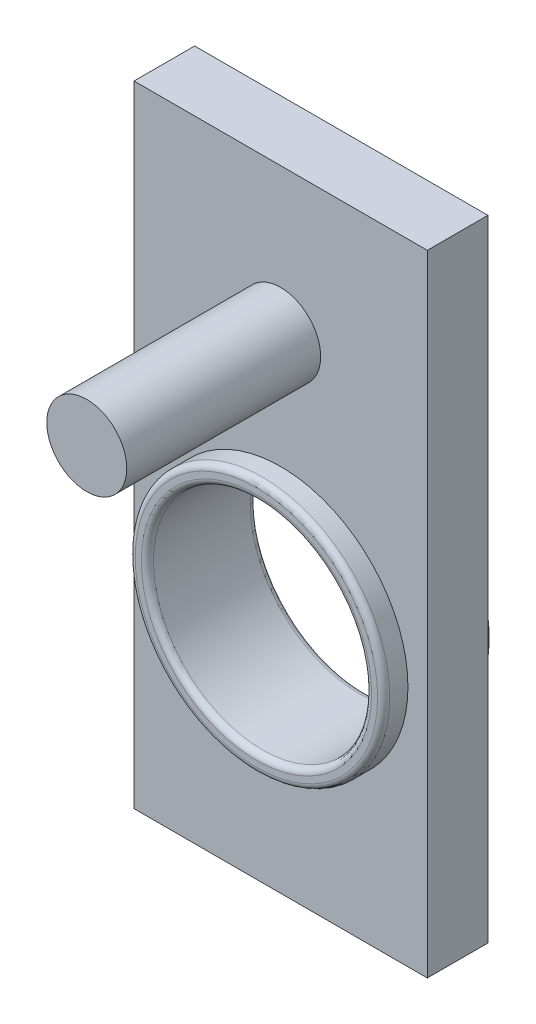
ISO-10303-21;
HEADER;
FILE_DESCRIPTION(('STEP AP214'),'2;1');
FILE_NAME('part.step','',(''),(''),'','','');
FILE_SCHEMA(('AUTOMOTIVE_DESIGN { 1 0 10303 214 1 1 1 1 }'));
ENDSEC;
DATA;
#1=APPLICATION_CONTEXT('core data for automotive mechanical design processes');
#2=APPLICATION_PROTOCOL_DEFINITION('international standard','automotive_design',2000,#1);
#3=PRODUCT_CONTEXT('',#1,'mechanical');
#4=PRODUCT('Part','Part','',(#3));
#5=PRODUCT_RELATED_PRODUCT_CATEGORY('part','',(#4));
#6=PRODUCT_DEFINITION_FORMATION('','',#4);
#7=PRODUCT_DEFINITION_CONTEXT('part definition',#1,'design');
#8=PRODUCT_DEFINITION('design','',#6,#7);
#9=PRODUCT_DEFINITION_SHAPE('','',#8);
#10=(LENGTH_UNIT() NAMED_UNIT(*) SI_UNIT(.MILLI.,.METRE.));
#11=(NAMED_UNIT(*) PLANE_ANGLE_UNIT() SI_UNIT($,.RADIAN.));
#12=(NAMED_UNIT(*) SI_UNIT($,.STERADIAN.) SOLID_ANGLE_UNIT());
#13=UNCERTAINTY_MEASURE_WITH_UNIT(LENGTH_MEASURE(1.E-05),#10,'distance_accuracy_value','');
#14=(GEOMETRIC_REPRESENTATION_CONTEXT(3) GLOBAL_UNCERTAINTY_ASSIGNED_CONTEXT((#13)) GLOBAL_UNIT_ASSIGNED_CONTEXT((#10,
#11,#12)) REPRESENTATION_CONTEXT('',''));
#15=CARTESIAN_POINT('',(0.,0.,0.));
#16=DIRECTION('',(0.,0.,1.));
#17=DIRECTION('',(1.,0.,0.));
#18=AXIS2_PLACEMENT_3D('',#15,#16,#17);
#19=CARTESIAN_POINT('',(-6.05,16.,2.5));
#20=DIRECTION('',(0.,0.,-1.));
#21=DIRECTION('',(-1.,0.,0.));
#22=AXIS2_PLACEMENT_3D('',#19,#20,#21);
#23=PLANE('',#22);
#24=CARTESIAN_POINT('',(0.,0.,2.5));
#25=DIRECTION('',(0.,0.,-1.));
#26=DIRECTION('',(-1.,0.,0.));
#27=AXIS2_PLACEMENT_3D('',#24,#25,#26);
#28=CIRCLE('',#27,5.25);
#29=CARTESIAN_POINT('',(-5.25,0.,2.5));
#30=VERTEX_POINT('',#29);
#31=EDGE_CURVE('E197',#30,#30,#28,.T.);
#32=ORIENTED_EDGE('',*,*,#31,.T.);
#33=EDGE_LOOP('',(#32));
#34=FACE_BOUND('',#33,.T.);
#35=DIRECTION('',(0.,-1.,0.));
#36=VECTOR('',#35,1.);
#37=CARTESIAN_POINT('',(-6.05,-10.,2.5));
#38=LINE('',#37,#36);
#39=CARTESIAN_POINT('',(-6.05,16.,2.5));
#40=VERTEX_POINT('',#39);
#41=CARTESIAN_POINT('',(-6.05,-10.,2.5));
#42=VERTEX_POINT('',#41);
#43=EDGE_CURVE('E84',#40,#42,#38,.T.);
#44=ORIENTED_EDGE('',*,*,#43,.T.);
#45=DIRECTION('',(1.,0.,0.));
#46=VECTOR('',#45,1.);
#47=CARTESIAN_POINT('',(-6.05,-10.,2.5));
#48=LINE('',#47,#46);
#49=CARTESIAN_POINT('',(6.05000000000001,-10.,2.5));
#50=VERTEX_POINT('',#49);
#51=EDGE_CURVE('E79',#42,#50,#48,.T.);
#52=ORIENTED_EDGE('',*,*,#51,.T.);
#53=DIRECTION('',(0.,1.,0.));
#54=VECTOR('',#53,1.);
#55=CARTESIAN_POINT('',(6.05000000000001,-10.,2.5));
#56=LINE('',#55,#54);
#57=CARTESIAN_POINT('',(6.05,16.,2.5));
#58=VERTEX_POINT('',#57);
#59=EDGE_CURVE('E82',#50,#58,#56,.T.);
#60=ORIENTED_EDGE('',*,*,#59,.T.);
#61=DIRECTION('',(-1.,0.,0.));
#62=VECTOR('',#61,1.);
#63=CARTESIAN_POINT('',(-6.05,16.,2.5));
#64=LINE('',#63,#62);
#65=EDGE_CURVE('E48',#58,#40,#64,.T.);
#66=ORIENTED_EDGE('',*,*,#65,.T.);
#67=EDGE_LOOP('',(#44,#52,#60,#66));
#68=FACE_BOUND('',#67,.T.);
#69=CARTESIAN_POINT('',(0.,10.,2.5));
#70=DIRECTION('',(0.,0.,-1.));
#71=DIRECTION('',(-1.,0.,0.));
#72=AXIS2_PLACEMENT_3D('',#69,#70,#71);
#73=CIRCLE('',#72,1.65);
#74=CARTESIAN_POINT('',(-1.65,10.,2.5));
#75=VERTEX_POINT('',#74);
#76=EDGE_CURVE('E109',#75,#75,#73,.F.);
#77=ORIENTED_EDGE('',*,*,#76,.F.);
#78=EDGE_LOOP('',(#77));
#79=FACE_BOUND('',#78,.T.);
#80=ADVANCED_FACE('F31',(#34,#68,#79),#23,.F.);
#81=CARTESIAN_POINT('',(-6.05,16.,0.));
#82=DIRECTION('',(0.,0.,-1.));
#83=DIRECTION('',(-1.,0.,0.));
#84=AXIS2_PLACEMENT_3D('',#81,#82,#83);
#85=PLANE('',#84);
#86=CARTESIAN_POINT('',(0.,0.,0.));
#87=DIRECTION('',(0.,0.,-1.));
#88=DIRECTION('',(-1.,0.,0.));
#89=AXIS2_PLACEMENT_3D('',#86,#87,#88);
#90=CIRCLE('',#89,5.25);
#91=CARTESIAN_POINT('',(-5.25,0.,0.));
#92=VERTEX_POINT('',#91);
#93=EDGE_CURVE('E112',#92,#92,#90,.T.);
#94=ORIENTED_EDGE('',*,*,#93,.F.);
#95=EDGE_LOOP('',(#94));
#96=FACE_BOUND('',#95,.T.);
#97=DIRECTION('',(0.,-1.,0.));
#98=VECTOR('',#97,1.);
#99=CARTESIAN_POINT('',(-6.05,-10.,0.));
#100=LINE('',#99,#98);
#101=CARTESIAN_POINT('',(-6.05,16.,0.));
#102=VERTEX_POINT('',#101);
#103=CARTESIAN_POINT('',(-6.05,-10.,0.));
#104=VERTEX_POINT('',#103);
#105=EDGE_CURVE('E99',#102,#104,#100,.T.);
#106=ORIENTED_EDGE('',*,*,#105,.F.);
#107=DIRECTION('',(-1.,0.,0.));
#108=VECTOR('',#107,1.);
#109=CARTESIAN_POINT('',(-6.05,16.,0.));
#110=LINE('',#109,#108);
#111=CARTESIAN_POINT('',(6.05,16.,0.));
#112=VERTEX_POINT('',#111);
#113=EDGE_CURVE('E71',#112,#102,#110,.T.);
#114=ORIENTED_EDGE('',*,*,#113,.F.);
#115=DIRECTION('',(0.,1.,0.));
#116=VECTOR('',#115,1.);
#117=CARTESIAN_POINT('',(6.05000000000001,-10.,0.));
#118=LINE('',#117,#116);
#119=CARTESIAN_POINT('',(6.05000000000001,-10.,0.));
#120=VERTEX_POINT('',#119);
#121=EDGE_CURVE('E65',#120,#112,#118,.T.);
#122=ORIENTED_EDGE('',*,*,#121,.F.);
#123=DIRECTION('',(1.,0.,0.));
#124=VECTOR('',#123,1.);
#125=CARTESIAN_POINT('',(-6.05,-10.,0.));
#126=LINE('',#125,#124);
#127=EDGE_CURVE('E89',#104,#120,#126,.T.);
#128=ORIENTED_EDGE('',*,*,#127,.F.);
#129=EDGE_LOOP('',(#106,#114,#122,#128));
#130=FACE_BOUND('',#129,.T.);
#131=ADVANCED_FACE('F147',(#96,#130),#85,.T.);
#132=CARTESIAN_POINT('',(-6.05,-10.,2.5));
#133=DIRECTION('',(1.,0.,0.));
#134=DIRECTION('',(0.,0.,-1.));
#135=AXIS2_PLACEMENT_3D('',#132,#133,#134);
#136=PLANE('',#135);
#137=ORIENTED_EDGE('',*,*,#105,.T.);
#138=DIRECTION('',(0.,0.,-1.));
#139=VECTOR('',#138,1.);
#140=CARTESIAN_POINT('',(-6.05,-10.,2.5));
#141=LINE('',#140,#139);
#142=EDGE_CURVE('E90',#42,#104,#141,.T.);
#143=ORIENTED_EDGE('',*,*,#142,.F.);
#144=ORIENTED_EDGE('',*,*,#43,.F.);
#145=DIRECTION('',(0.,0.,-1.));
#146=VECTOR('',#145,1.);
#147=CARTESIAN_POINT('',(-6.05,16.,2.5));
#148=LINE('',#147,#146);
#149=EDGE_CURVE('E95',#40,#102,#148,.T.);
#150=ORIENTED_EDGE('',*,*,#149,.T.);
#151=EDGE_LOOP('',(#137,#143,#144,#150));
#152=FACE_BOUND('',#151,.T.);
#153=ADVANCED_FACE('F153',(#152),#136,.F.);
#154=CARTESIAN_POINT('',(-6.05,-10.,2.5));
#155=DIRECTION('',(0.,1.,0.));
#156=DIRECTION('',(-1.,0.,0.));
#157=AXIS2_PLACEMENT_3D('',#154,#155,#156);
#158=PLANE('',#157);
#159=ORIENTED_EDGE('',*,*,#127,.T.);
#160=DIRECTION('',(0.,0.,-1.));
#161=VECTOR('',#160,1.);
#162=CARTESIAN_POINT('',(6.05000000000001,-10.,2.5));
#163=LINE('',#162,#161);
#164=EDGE_CURVE('E87',#50,#120,#163,.T.);
#165=ORIENTED_EDGE('',*,*,#164,.F.);
#166=ORIENTED_EDGE('',*,*,#51,.F.);
#167=ORIENTED_EDGE('',*,*,#142,.T.);
#168=EDGE_LOOP('',(#159,#165,#166,#167));
#169=FACE_BOUND('',#168,.T.);
#170=ADVANCED_FACE('F88',(#169),#158,.F.);
#171=CARTESIAN_POINT('',(6.05000000000001,-10.,2.5));
#172=DIRECTION('',(-1.,0.,0.));
#173=DIRECTION('',(0.,-1.,0.));
#174=AXIS2_PLACEMENT_3D('',#171,#172,#173);
#175=PLANE('',#174);
#176=ORIENTED_EDGE('',*,*,#121,.T.);
#177=DIRECTION('',(0.,0.,-1.));
#178=VECTOR('',#177,1.);
#179=CARTESIAN_POINT('',(6.05,16.,2.5));
#180=LINE('',#179,#178);
#181=EDGE_CURVE('E91',#58,#112,#180,.T.);
#182=ORIENTED_EDGE('',*,*,#181,.F.);
#183=ORIENTED_EDGE('',*,*,#59,.F.);
#184=ORIENTED_EDGE('',*,*,#164,.T.);
#185=EDGE_LOOP('',(#176,#182,#183,#184));
#186=FACE_BOUND('',#185,.T.);
#187=ADVANCED_FACE('F93',(#186),#175,.F.);
#188=CARTESIAN_POINT('',(-6.05,16.,2.5));
#189=DIRECTION('',(0.,-1.,0.));
#190=DIRECTION('',(0.,0.,-1.));
#191=AXIS2_PLACEMENT_3D('',#188,#189,#190);
#192=PLANE('',#191);
#193=ORIENTED_EDGE('',*,*,#113,.T.);
#194=ORIENTED_EDGE('',*,*,#149,.F.);
#195=ORIENTED_EDGE('',*,*,#65,.F.);
#196=ORIENTED_EDGE('',*,*,#181,.T.);
#197=EDGE_LOOP('',(#193,#194,#195,#196));
#198=FACE_BOUND('',#197,.T.);
#199=ADVANCED_FACE('F160',(#198),#192,.F.);
#200=CARTESIAN_POINT('',(0.,10.,10.5));
#201=DIRECTION('',(0.,0.,-1.));
#202=DIRECTION('',(-1.,0.,0.));
#203=AXIS2_PLACEMENT_3D('',#200,#201,#202);
#204=CYLINDRICAL_SURFACE('',#203,1.65);
#205=CARTESIAN_POINT('',(0.,10.,10.5));
#206=DIRECTION('',(0.,0.,1.));
#207=DIRECTION('',(1.,0.,0.));
#208=AXIS2_PLACEMENT_3D('',#205,#206,#207);
#209=CIRCLE('',#208,1.65);
#210=CARTESIAN_POINT('',(1.65,10.,10.5));
#211=VERTEX_POINT('',#210);
#212=EDGE_CURVE('E102',#211,#211,#209,.T.);
#213=ORIENTED_EDGE('',*,*,#212,.F.);
#214=EDGE_LOOP('',(#213));
#215=FACE_BOUND('',#214,.T.);
#216=ORIENTED_EDGE('',*,*,#76,.T.);
#217=EDGE_LOOP('',(#216));
#218=FACE_BOUND('',#217,.T.);
#219=ADVANCED_FACE('F163',(#215,#218),#204,.T.);
#220=CARTESIAN_POINT('',(0.,10.,10.5));
#221=DIRECTION('',(0.,0.,1.));
#222=DIRECTION('',(1.,0.,0.));
#223=AXIS2_PLACEMENT_3D('',#220,#221,#222);
#224=PLANE('',#223);
#225=ORIENTED_EDGE('',*,*,#212,.T.);
#226=EDGE_LOOP('',(#225));
#227=FACE_BOUND('',#226,.T.);
#228=ADVANCED_FACE('F188',(#227),#224,.T.);
#229=CARTESIAN_POINT('',(0.,0.,-1.));
#230=DIRECTION('',(0.,0.,1.));
#231=DIRECTION('',(1.,0.,0.));
#232=AXIS2_PLACEMENT_3D('',#229,#230,#231);
#233=CYLINDRICAL_SURFACE('',#232,5.25);
#234=CARTESIAN_POINT('',(0.,0.,-0.75));
#235=DIRECTION('',(0.,0.,1.));
#236=DIRECTION('',(1.,0.,0.));
#237=AXIS2_PLACEMENT_3D('',#234,#235,#236);
#238=CIRCLE('',#237,5.25);
#239=CARTESIAN_POINT('',(5.25,0.,-0.75));
#240=VERTEX_POINT('',#239);
#241=EDGE_CURVE('E124',#240,#240,#238,.T.);
#242=ORIENTED_EDGE('',*,*,#241,.T.);
#243=EDGE_LOOP('',(#242));
#244=FACE_BOUND('',#243,.T.);
#245=ORIENTED_EDGE('',*,*,#93,.T.);
#246=EDGE_LOOP('',(#245));
#247=FACE_BOUND('',#246,.T.);
#248=ADVANCED_FACE('F184',(#244,#247),#233,.T.);
#249=CARTESIAN_POINT('',(0.,0.,-1.));
#250=DIRECTION('',(0.,0.,1.));
#251=DIRECTION('',(1.,0.,0.));
#252=AXIS2_PLACEMENT_3D('',#249,#250,#251);
#253=PLANE('',#252);
#254=CARTESIAN_POINT('',(0.,0.,-1.));
#255=DIRECTION('',(0.,0.,1.));
#256=DIRECTION('',(1.,0.,0.));
#257=AXIS2_PLACEMENT_3D('',#254,#255,#256);
#258=CIRCLE('',#257,5.);
#259=CARTESIAN_POINT('',(5.,0.,-1.));
#260=VERTEX_POINT('',#259);
#261=EDGE_CURVE('E130',#260,#260,#258,.F.);
#262=ORIENTED_EDGE('',*,*,#261,.T.);
#263=EDGE_LOOP('',(#262));
#264=FACE_BOUND('',#263,.T.);
#265=CARTESIAN_POINT('',(0.,0.,-1.));
#266=DIRECTION('',(0.,0.,1.));
#267=DIRECTION('',(1.,0.,0.));
#268=AXIS2_PLACEMENT_3D('',#265,#266,#267);
#269=CIRCLE('',#268,4.75);
#270=CARTESIAN_POINT('',(4.75,0.,-1.));
#271=VERTEX_POINT('',#270);
#272=EDGE_CURVE('E127',#271,#271,#269,.T.);
#273=ORIENTED_EDGE('',*,*,#272,.T.);
#274=EDGE_LOOP('',(#273));
#275=FACE_BOUND('',#274,.T.);
#276=ADVANCED_FACE('F187',(#264,#275),#253,.F.);
#277=CARTESIAN_POINT('',(0.,0.,2.5));
#278=DIRECTION('',(0.,0.,-1.));
#279=DIRECTION('',(-1.,0.,0.));
#280=AXIS2_PLACEMENT_3D('',#277,#278,#279);
#281=CYLINDRICAL_SURFACE('',#280,4.5);
#282=CARTESIAN_POINT('',(0.,0.,-0.75));
#283=DIRECTION('',(0.,0.,1.));
#284=DIRECTION('',(1.,0.,0.));
#285=AXIS2_PLACEMENT_3D('',#282,#283,#284);
#286=CIRCLE('',#285,4.5);
#287=CARTESIAN_POINT('',(4.5,0.,-0.75));
#288=VERTEX_POINT('',#287);
#289=EDGE_CURVE('E11',#288,#288,#286,.F.);
#290=ORIENTED_EDGE('',*,*,#289,.T.);
#291=EDGE_LOOP('',(#290));
#292=FACE_BOUND('',#291,.T.);
#293=CARTESIAN_POINT('',(0.,0.,3.25));
#294=DIRECTION('',(0.,0.,1.));
#295=DIRECTION('',(1.,0.,0.));
#296=AXIS2_PLACEMENT_3D('',#293,#294,#295);
#297=CIRCLE('',#296,4.5);
#298=CARTESIAN_POINT('',(4.5,0.,3.25));
#299=VERTEX_POINT('',#298);
#300=EDGE_CURVE('E40',#299,#299,#297,.T.);
#301=ORIENTED_EDGE('',*,*,#300,.T.);
#302=EDGE_LOOP('',(#301));
#303=FACE_BOUND('',#302,.T.);
#304=ADVANCED_FACE('F135',(#292,#303),#281,.F.);
#305=CARTESIAN_POINT('',(0.,0.,3.25));
#306=DIRECTION('',(0.,0.,1.));
#307=DIRECTION('',(1.,0.,0.));
#308=AXIS2_PLACEMENT_3D('',#305,#306,#307);
#309=CIRCLE('',#308,5.25);
#310=CARTESIAN_POINT('',(5.25,0.,3.25));
#311=VERTEX_POINT('',#310);
#312=EDGE_CURVE('E121',#311,#311,#309,.F.);
#313=ORIENTED_EDGE('',*,*,#312,.T.);
#314=EDGE_LOOP('',(#313));
#315=FACE_BOUND('',#314,.T.);
#316=ORIENTED_EDGE('',*,*,#31,.F.);
#317=EDGE_LOOP('',(#316));
#318=FACE_BOUND('',#317,.T.);
#319=ADVANCED_FACE('F190',(#315,#318),#233,.T.);
#320=CARTESIAN_POINT('',(0.,0.,3.5));
#321=DIRECTION('',(0.,0.,1.));
#322=DIRECTION('',(1.,0.,0.));
#323=AXIS2_PLACEMENT_3D('',#320,#321,#322);
#324=PLANE('',#323);
#325=CARTESIAN_POINT('',(0.,0.,3.5));
#326=DIRECTION('',(0.,0.,1.));
#327=DIRECTION('',(1.,0.,0.));
#328=AXIS2_PLACEMENT_3D('',#325,#326,#327);
#329=CIRCLE('',#328,5.);
#330=CARTESIAN_POINT('',(5.,0.,3.5));
#331=VERTEX_POINT('',#330);
#332=EDGE_CURVE('E118',#331,#331,#329,.T.);
#333=ORIENTED_EDGE('',*,*,#332,.T.);
#334=EDGE_LOOP('',(#333));
#335=FACE_BOUND('',#334,.T.);
#336=CARTESIAN_POINT('',(0.,0.,3.5));
#337=DIRECTION('',(0.,0.,1.));
#338=DIRECTION('',(1.,0.,0.));
#339=AXIS2_PLACEMENT_3D('',#336,#337,#338);
#340=CIRCLE('',#339,4.75);
#341=CARTESIAN_POINT('',(4.75,0.,3.5));
#342=VERTEX_POINT('',#341);
#343=EDGE_CURVE('E115',#342,#342,#340,.F.);
#344=ORIENTED_EDGE('',*,*,#343,.T.);
#345=EDGE_LOOP('',(#344));
#346=FACE_BOUND('',#345,.T.);
#347=ADVANCED_FACE('F174',(#335,#346),#324,.T.);
#348=CARTESIAN_POINT('',(0.,0.,3.25));
#349=DIRECTION('',(0.,0.,1.));
#350=DIRECTION('',(1.,0.,0.));
#351=AXIS2_PLACEMENT_3D('',#348,#349,#350);
#352=TOROIDAL_SURFACE('',#351,5.,0.25);
#353=ORIENTED_EDGE('',*,*,#312,.F.);
#354=EDGE_LOOP('',(#353));
#355=FACE_BOUND('',#354,.T.);
#356=ORIENTED_EDGE('',*,*,#332,.F.);
#357=EDGE_LOOP('',(#356));
#358=FACE_BOUND('',#357,.T.);
#359=ADVANCED_FACE('F171',(#355,#358),#352,.T.);
#360=CARTESIAN_POINT('',(0.,0.,-0.75));
#361=DIRECTION('',(0.,0.,1.));
#362=DIRECTION('',(1.,0.,0.));
#363=AXIS2_PLACEMENT_3D('',#360,#361,#362);
#364=TOROIDAL_SURFACE('',#363,5.,0.25);
#365=ORIENTED_EDGE('',*,*,#261,.F.);
#366=EDGE_LOOP('',(#365));
#367=FACE_BOUND('',#366,.T.);
#368=ORIENTED_EDGE('',*,*,#241,.F.);
#369=EDGE_LOOP('',(#368));
#370=FACE_BOUND('',#369,.T.);
#371=ADVANCED_FACE('F143',(#367,#370),#364,.T.);
#372=CARTESIAN_POINT('',(0.,0.,-0.75));
#373=DIRECTION('',(0.,0.,1.));
#374=DIRECTION('',(1.,0.,0.));
#375=AXIS2_PLACEMENT_3D('',#372,#373,#374);
#376=TOROIDAL_SURFACE('',#375,4.75,0.25);
#377=ORIENTED_EDGE('',*,*,#289,.F.);
#378=EDGE_LOOP('',(#377));
#379=FACE_BOUND('',#378,.T.);
#380=ORIENTED_EDGE('',*,*,#272,.F.);
#381=EDGE_LOOP('',(#380));
#382=FACE_BOUND('',#381,.T.);
#383=ADVANCED_FACE('F138',(#379,#382),#376,.T.);
#384=CARTESIAN_POINT('',(0.,0.,3.25));
#385=DIRECTION('',(0.,0.,1.));
#386=DIRECTION('',(1.,0.,0.));
#387=AXIS2_PLACEMENT_3D('',#384,#385,#386);
#388=TOROIDAL_SURFACE('',#387,4.75,0.25);
#389=ORIENTED_EDGE('',*,*,#343,.F.);
#390=EDGE_LOOP('',(#389));
#391=FACE_BOUND('',#390,.T.);
#392=ORIENTED_EDGE('',*,*,#300,.F.);
#393=EDGE_LOOP('',(#392));
#394=FACE_BOUND('',#393,.T.);
#395=ADVANCED_FACE('F33',(#391,#394),#388,.T.);
#396=CLOSED_SHELL('',(#80,#131,#153,#170,#187,#199,#219,#228,#248,#276,#304,#319,#347,#359,#371,
#383,#395));
#397=MANIFOLD_SOLID_BREP('B2',#396);
#398=ADVANCED_BREP_SHAPE_REPRESENTATION('',(#18,#397),#14);
#399=SHAPE_DEFINITION_REPRESENTATION(#9,#398);
ENDSEC;
END-ISO-10303-21;
